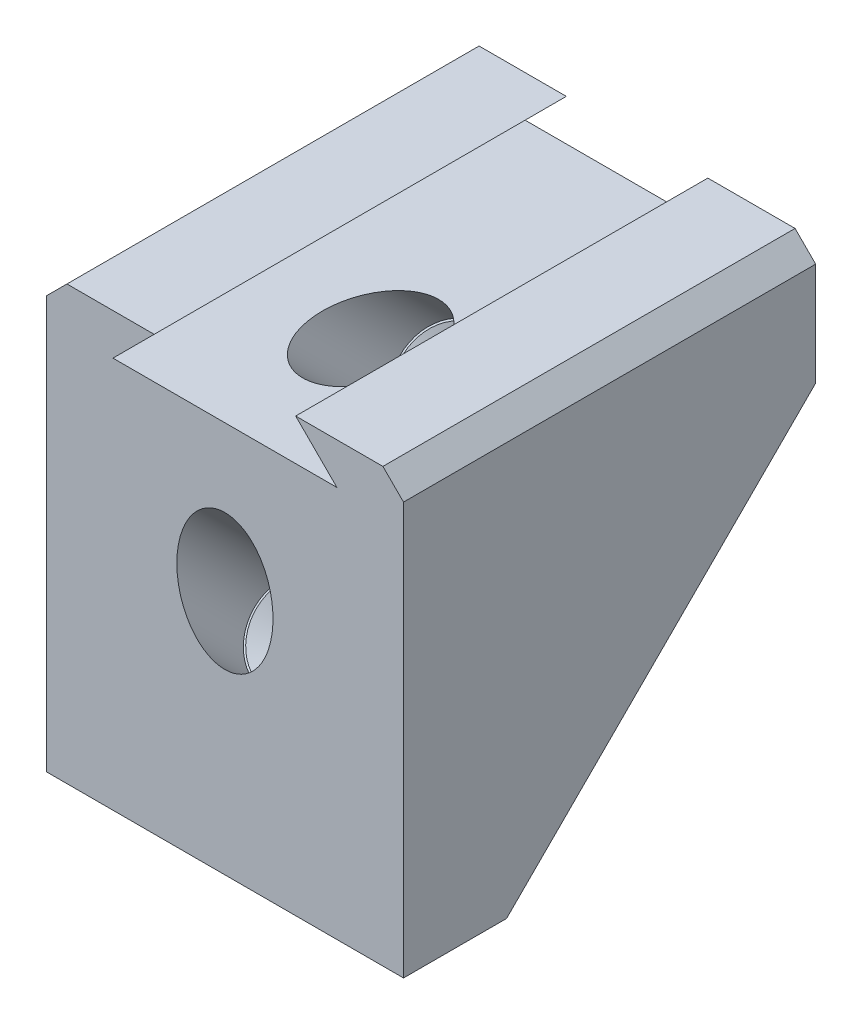
ISO-10303-21;
HEADER;
FILE_DESCRIPTION(('STEP AP214'),'2;1');
FILE_NAME('part.step','',(''),(''),'','','');
FILE_SCHEMA(('AUTOMOTIVE_DESIGN { 1 0 10303 214 1 1 1 1 }'));
ENDSEC;
DATA;
#1=APPLICATION_CONTEXT('core data for automotive mechanical design processes');
#2=APPLICATION_PROTOCOL_DEFINITION('international standard','automotive_design',2000,#1);
#3=PRODUCT_CONTEXT('',#1,'mechanical');
#4=PRODUCT('Part','Part','',(#3));
#5=PRODUCT_RELATED_PRODUCT_CATEGORY('part','',(#4));
#6=PRODUCT_DEFINITION_FORMATION('','',#4);
#7=PRODUCT_DEFINITION_CONTEXT('part definition',#1,'design');
#8=PRODUCT_DEFINITION('design','',#6,#7);
#9=PRODUCT_DEFINITION_SHAPE('','',#8);
#10=(LENGTH_UNIT() NAMED_UNIT(*) SI_UNIT(.MILLI.,.METRE.));
#11=(NAMED_UNIT(*) PLANE_ANGLE_UNIT() SI_UNIT($,.RADIAN.));
#12=(NAMED_UNIT(*) SI_UNIT($,.STERADIAN.) SOLID_ANGLE_UNIT());
#13=UNCERTAINTY_MEASURE_WITH_UNIT(LENGTH_MEASURE(1.E-05),#10,'distance_accuracy_value','');
#14=(GEOMETRIC_REPRESENTATION_CONTEXT(3) GLOBAL_UNCERTAINTY_ASSIGNED_CONTEXT((#13)) GLOBAL_UNIT_ASSIGNED_CONTEXT((#10,
#11,#12)) REPRESENTATION_CONTEXT('',''));
#15=CARTESIAN_POINT('',(0.,0.,0.));
#16=DIRECTION('',(0.,0.,1.));
#17=DIRECTION('',(1.,0.,0.));
#18=AXIS2_PLACEMENT_3D('',#15,#16,#17);
#19=CARTESIAN_POINT('',(13.,0.,30.));
#20=DIRECTION('',(-1.,0.,0.));
#21=DIRECTION('',(0.,-1.,0.));
#22=AXIS2_PLACEMENT_3D('',#19,#20,#21);
#23=PLANE('',#22);
#24=DIRECTION('',(0.,1.,0.));
#25=VECTOR('',#24,1.);
#26=CARTESIAN_POINT('',(13.,0.,0.));
#27=LINE('',#26,#25);
#28=CARTESIAN_POINT('',(13.,0.,0.));
#29=VERTEX_POINT('',#28);
#30=CARTESIAN_POINT('',(13.,7.4999999999999,0.));
#31=VERTEX_POINT('',#30);
#32=EDGE_CURVE('E94',#29,#31,#27,.T.);
#33=ORIENTED_EDGE('',*,*,#32,.T.);
#34=DIRECTION('',(0.,0.,-1.));
#35=VECTOR('',#34,1.);
#36=CARTESIAN_POINT('',(13.,7.4999999999999,30.));
#37=LINE('',#36,#35);
#38=CARTESIAN_POINT('',(13.,7.4999999999999,30.));
#39=VERTEX_POINT('',#38);
#40=EDGE_CURVE('E11',#39,#31,#37,.T.);
#41=ORIENTED_EDGE('',*,*,#40,.F.);
#42=DIRECTION('',(0.,1.,0.));
#43=VECTOR('',#42,1.);
#44=CARTESIAN_POINT('',(13.,0.,30.));
#45=LINE('',#44,#43);
#46=CARTESIAN_POINT('',(13.,-22.5000000000002,30.));
#47=VERTEX_POINT('',#46);
#48=EDGE_CURVE('E168',#47,#39,#45,.T.);
#49=ORIENTED_EDGE('',*,*,#48,.F.);
#50=DIRECTION('',(0.,0.,-1.));
#51=VECTOR('',#50,1.);
#52=CARTESIAN_POINT('',(13.,-22.5000000000002,22.5000000000001));
#53=LINE('',#52,#51);
#54=CARTESIAN_POINT('',(13.,-22.5000000000002,22.5000000000001));
#55=VERTEX_POINT('',#54);
#56=EDGE_CURVE('E209',#47,#55,#53,.T.);
#57=ORIENTED_EDGE('',*,*,#56,.T.);
#58=DIRECTION('',(0.,0.707106781186549,-0.707106781186546));
#59=VECTOR('',#58,1.);
#60=CARTESIAN_POINT('',(13.,-22.5000000000002,22.5000000000001));
#61=LINE('',#60,#59);
#62=EDGE_CURVE('E203',#55,#29,#61,.T.);
#63=ORIENTED_EDGE('',*,*,#62,.T.);
#64=EDGE_LOOP('',(#33,#41,#49,#57,#63));
#65=FACE_BOUND('',#64,.T.);
#66=ADVANCED_FACE('F39',(#65),#23,.F.);
#67=CARTESIAN_POINT('',(13.,7.4999999999999,30.));
#68=DIRECTION('',(-0.707106781186529,-0.707106781186565,0.));
#69=DIRECTION('',(0.707106781186566,-0.70710678118653,0.));
#70=AXIS2_PLACEMENT_3D('',#67,#68,#69);
#71=PLANE('',#70);
#72=DIRECTION('',(-0.707106781186565,0.707106781186529,0.));
#73=VECTOR('',#72,1.);
#74=CARTESIAN_POINT('',(13.,7.4999999999999,0.));
#75=LINE('',#74,#73);
#76=CARTESIAN_POINT('',(11.5,8.99999999999982,0.));
#77=VERTEX_POINT('',#76);
#78=EDGE_CURVE('E150',#31,#77,#75,.T.);
#79=ORIENTED_EDGE('',*,*,#78,.T.);
#80=DIRECTION('',(0.,0.,-1.));
#81=VECTOR('',#80,1.);
#82=CARTESIAN_POINT('',(11.5,8.99999999999982,30.));
#83=LINE('',#82,#81);
#84=CARTESIAN_POINT('',(11.5,8.99999999999982,30.));
#85=VERTEX_POINT('',#84);
#86=EDGE_CURVE('E47',#85,#77,#83,.T.);
#87=ORIENTED_EDGE('',*,*,#86,.F.);
#88=DIRECTION('',(-0.707106781186565,0.707106781186529,0.));
#89=VECTOR('',#88,1.);
#90=CARTESIAN_POINT('',(13.,7.4999999999999,30.));
#91=LINE('',#90,#89);
#92=EDGE_CURVE('E102',#39,#85,#91,.T.);
#93=ORIENTED_EDGE('',*,*,#92,.F.);
#94=ORIENTED_EDGE('',*,*,#40,.T.);
#95=EDGE_LOOP('',(#79,#87,#93,#94));
#96=FACE_BOUND('',#95,.T.);
#97=ADVANCED_FACE('F274',(#96),#71,.F.);
#98=CARTESIAN_POINT('',(11.5,8.99999999999982,30.));
#99=DIRECTION('',(0.,-1.,0.));
#100=DIRECTION('',(1.,0.,0.));
#101=AXIS2_PLACEMENT_3D('',#98,#99,#100);
#102=PLANE('',#101);
#103=DIRECTION('',(-1.,0.,0.));
#104=VECTOR('',#103,1.);
#105=CARTESIAN_POINT('',(11.5,8.99999999999982,0.));
#106=LINE('',#105,#104);
#107=CARTESIAN_POINT('',(5.15000000000002,8.99999999999982,0.));
#108=VERTEX_POINT('',#107);
#109=EDGE_CURVE('E153',#77,#108,#106,.T.);
#110=ORIENTED_EDGE('',*,*,#109,.T.);
#111=DIRECTION('',(0.,0.,-1.));
#112=VECTOR('',#111,1.);
#113=CARTESIAN_POINT('',(5.15000000000002,8.99999999999982,30.));
#114=LINE('',#113,#112);
#115=CARTESIAN_POINT('',(5.15000000000002,8.99999999999982,30.));
#116=VERTEX_POINT('',#115);
#117=EDGE_CURVE('E175',#116,#108,#114,.T.);
#118=ORIENTED_EDGE('',*,*,#117,.F.);
#119=DIRECTION('',(-1.,0.,0.));
#120=VECTOR('',#119,1.);
#121=CARTESIAN_POINT('',(11.5,8.99999999999982,30.));
#122=LINE('',#121,#120);
#123=EDGE_CURVE('E183',#85,#116,#122,.T.);
#124=ORIENTED_EDGE('',*,*,#123,.F.);
#125=ORIENTED_EDGE('',*,*,#86,.T.);
#126=EDGE_LOOP('',(#110,#118,#124,#125));
#127=FACE_BOUND('',#126,.T.);
#128=ADVANCED_FACE('F181',(#127),#102,.F.);
#129=CARTESIAN_POINT('',(5.15000000000002,8.99999999999982,30.));
#130=DIRECTION('',(0.70710678118653,0.707106781186565,0.));
#131=DIRECTION('',(-0.707106781186565,0.70710678118653,0.));
#132=AXIS2_PLACEMENT_3D('',#129,#130,#131);
#133=PLANE('',#132);
#134=DIRECTION('',(0.707106781186565,-0.70710678118653,0.));
#135=VECTOR('',#134,1.);
#136=CARTESIAN_POINT('',(5.15000000000002,8.99999999999982,0.));
#137=LINE('',#136,#135);
#138=CARTESIAN_POINT('',(8.15,6.,0.));
#139=VERTEX_POINT('',#138);
#140=EDGE_CURVE('E155',#108,#139,#137,.T.);
#141=ORIENTED_EDGE('',*,*,#140,.T.);
#142=DIRECTION('',(0.,0.,-1.));
#143=VECTOR('',#142,1.);
#144=CARTESIAN_POINT('',(8.15,6.,30.));
#145=LINE('',#144,#143);
#146=CARTESIAN_POINT('',(8.15,6.,30.));
#147=VERTEX_POINT('',#146);
#148=EDGE_CURVE('E172',#147,#139,#145,.T.);
#149=ORIENTED_EDGE('',*,*,#148,.F.);
#150=DIRECTION('',(0.707106781186565,-0.70710678118653,0.));
#151=VECTOR('',#150,1.);
#152=CARTESIAN_POINT('',(5.15000000000002,8.99999999999982,30.));
#153=LINE('',#152,#151);
#154=EDGE_CURVE('E193',#116,#147,#153,.T.);
#155=ORIENTED_EDGE('',*,*,#154,.F.);
#156=ORIENTED_EDGE('',*,*,#117,.T.);
#157=EDGE_LOOP('',(#141,#149,#155,#156));
#158=FACE_BOUND('',#157,.T.);
#159=ADVANCED_FACE('F189',(#158),#133,.F.);
#160=CARTESIAN_POINT('',(8.15,6.,30.));
#161=DIRECTION('',(0.,-1.,0.));
#162=DIRECTION('',(0.,0.,-1.));
#163=AXIS2_PLACEMENT_3D('',#160,#161,#162);
#164=PLANE('',#163);
#165=CARTESIAN_POINT('',(0.,6.,19.3933982822018));
#166=DIRECTION('',(0.,-1.,0.));
#167=DIRECTION('',(0.,0.,-1.));
#168=AXIS2_PLACEMENT_3D('',#165,#166,#167);
#169=ELLIPSE('',#168,4.94974746830584,3.5);
#170=CARTESIAN_POINT('',(0.,6.,14.4436508138959));
#171=VERTEX_POINT('',#170);
#172=EDGE_CURVE('E217',#171,#171,#169,.T.);
#173=ORIENTED_EDGE('',*,*,#172,.T.);
#174=EDGE_LOOP('',(#173));
#175=FACE_BOUND('',#174,.T.);
#176=DIRECTION('',(-1.,0.,0.));
#177=VECTOR('',#176,1.);
#178=CARTESIAN_POINT('',(8.15,6.,0.));
#179=LINE('',#178,#177);
#180=CARTESIAN_POINT('',(-8.15,6.,0.));
#181=VERTEX_POINT('',#180);
#182=EDGE_CURVE('E157',#139,#181,#179,.T.);
#183=ORIENTED_EDGE('',*,*,#182,.T.);
#184=DIRECTION('',(0.,0.,-1.));
#185=VECTOR('',#184,1.);
#186=CARTESIAN_POINT('',(-8.15,6.,30.));
#187=LINE('',#186,#185);
#188=CARTESIAN_POINT('',(-8.15,6.,30.));
#189=VERTEX_POINT('',#188);
#190=EDGE_CURVE('E138',#189,#181,#187,.T.);
#191=ORIENTED_EDGE('',*,*,#190,.F.);
#192=DIRECTION('',(-1.,0.,0.));
#193=VECTOR('',#192,1.);
#194=CARTESIAN_POINT('',(8.15,6.,30.));
#195=LINE('',#194,#193);
#196=EDGE_CURVE('E126',#147,#189,#195,.T.);
#197=ORIENTED_EDGE('',*,*,#196,.F.);
#198=ORIENTED_EDGE('',*,*,#148,.T.);
#199=EDGE_LOOP('',(#183,#191,#197,#198));
#200=FACE_BOUND('',#199,.T.);
#201=ADVANCED_FACE('F192',(#175,#200),#164,.F.);
#202=CARTESIAN_POINT('',(-8.15,6.,30.));
#203=DIRECTION('',(-0.707106781186523,0.707106781186572,0.));
#204=DIRECTION('',(-0.707106781186572,-0.707106781186523,0.));
#205=AXIS2_PLACEMENT_3D('',#202,#203,#204);
#206=PLANE('',#205);
#207=DIRECTION('',(0.707106781186572,0.707106781186523,0.));
#208=VECTOR('',#207,1.);
#209=CARTESIAN_POINT('',(-8.15,6.,0.));
#210=LINE('',#209,#208);
#211=CARTESIAN_POINT('',(-5.14999999999997,8.99999999999982,0.));
#212=VERTEX_POINT('',#211);
#213=EDGE_CURVE('E135',#181,#212,#210,.T.);
#214=ORIENTED_EDGE('',*,*,#213,.T.);
#215=DIRECTION('',(0.,0.,-1.));
#216=VECTOR('',#215,1.);
#217=CARTESIAN_POINT('',(-5.14999999999997,8.99999999999982,30.));
#218=LINE('',#217,#216);
#219=CARTESIAN_POINT('',(-5.14999999999997,8.99999999999982,30.));
#220=VERTEX_POINT('',#219);
#221=EDGE_CURVE('E132',#220,#212,#218,.T.);
#222=ORIENTED_EDGE('',*,*,#221,.F.);
#223=DIRECTION('',(0.707106781186572,0.707106781186523,0.));
#224=VECTOR('',#223,1.);
#225=CARTESIAN_POINT('',(-8.15,6.,30.));
#226=LINE('',#225,#224);
#227=EDGE_CURVE('E119',#189,#220,#226,.T.);
#228=ORIENTED_EDGE('',*,*,#227,.F.);
#229=ORIENTED_EDGE('',*,*,#190,.T.);
#230=EDGE_LOOP('',(#214,#222,#228,#229));
#231=FACE_BOUND('',#230,.T.);
#232=ADVANCED_FACE('F133',(#231),#206,.F.);
#233=CARTESIAN_POINT('',(-5.14999999999997,8.99999999999982,30.));
#234=DIRECTION('',(0.,-1.,0.));
#235=DIRECTION('',(1.,0.,0.));
#236=AXIS2_PLACEMENT_3D('',#233,#234,#235);
#237=PLANE('',#236);
#238=DIRECTION('',(-1.,0.,0.));
#239=VECTOR('',#238,1.);
#240=CARTESIAN_POINT('',(-5.14999999999997,8.99999999999982,0.));
#241=LINE('',#240,#239);
#242=CARTESIAN_POINT('',(-11.5,8.99999999999982,0.));
#243=VERTEX_POINT('',#242);
#244=EDGE_CURVE('E160',#212,#243,#241,.T.);
#245=ORIENTED_EDGE('',*,*,#244,.T.);
#246=DIRECTION('',(0.,0.,-1.));
#247=VECTOR('',#246,1.);
#248=CARTESIAN_POINT('',(-11.5,8.99999999999982,30.));
#249=LINE('',#248,#247);
#250=CARTESIAN_POINT('',(-11.5,8.99999999999982,30.));
#251=VERTEX_POINT('',#250);
#252=EDGE_CURVE('E139',#251,#243,#249,.T.);
#253=ORIENTED_EDGE('',*,*,#252,.F.);
#254=DIRECTION('',(-1.,0.,0.));
#255=VECTOR('',#254,1.);
#256=CARTESIAN_POINT('',(-5.14999999999997,8.99999999999982,30.));
#257=LINE('',#256,#255);
#258=EDGE_CURVE('E123',#220,#251,#257,.T.);
#259=ORIENTED_EDGE('',*,*,#258,.F.);
#260=ORIENTED_EDGE('',*,*,#221,.T.);
#261=EDGE_LOOP('',(#245,#253,#259,#260));
#262=FACE_BOUND('',#261,.T.);
#263=ADVANCED_FACE('F141',(#262),#237,.F.);
#264=CARTESIAN_POINT('',(-11.5,8.99999999999982,30.));
#265=DIRECTION('',(0.707106781186522,-0.707106781186572,0.));
#266=DIRECTION('',(0.707106781186573,0.707106781186523,0.));
#267=AXIS2_PLACEMENT_3D('',#264,#265,#266);
#268=PLANE('',#267);
#269=DIRECTION('',(-0.707106781186573,-0.707106781186523,0.));
#270=VECTOR('',#269,1.);
#271=CARTESIAN_POINT('',(-11.5,8.99999999999982,0.));
#272=LINE('',#271,#270);
#273=CARTESIAN_POINT('',(-13.,7.49999999999992,0.));
#274=VERTEX_POINT('',#273);
#275=EDGE_CURVE('E87',#243,#274,#272,.T.);
#276=ORIENTED_EDGE('',*,*,#275,.T.);
#277=DIRECTION('',(0.,0.,-1.));
#278=VECTOR('',#277,1.);
#279=CARTESIAN_POINT('',(-13.,7.49999999999992,30.));
#280=LINE('',#279,#278);
#281=CARTESIAN_POINT('',(-13.,7.49999999999992,30.));
#282=VERTEX_POINT('',#281);
#283=EDGE_CURVE('E148',#282,#274,#280,.T.);
#284=ORIENTED_EDGE('',*,*,#283,.F.);
#285=DIRECTION('',(-0.707106781186573,-0.707106781186523,0.));
#286=VECTOR('',#285,1.);
#287=CARTESIAN_POINT('',(-11.5,8.99999999999982,30.));
#288=LINE('',#287,#286);
#289=EDGE_CURVE('E55',#251,#282,#288,.T.);
#290=ORIENTED_EDGE('',*,*,#289,.F.);
#291=ORIENTED_EDGE('',*,*,#252,.T.);
#292=EDGE_LOOP('',(#276,#284,#290,#291));
#293=FACE_BOUND('',#292,.T.);
#294=ADVANCED_FACE('F301',(#293),#268,.F.);
#295=CARTESIAN_POINT('',(-13.,7.49999999999992,30.));
#296=DIRECTION('',(1.,0.,0.));
#297=DIRECTION('',(0.,1.,0.));
#298=AXIS2_PLACEMENT_3D('',#295,#296,#297);
#299=PLANE('',#298);
#300=DIRECTION('',(0.,-1.,0.));
#301=VECTOR('',#300,1.);
#302=CARTESIAN_POINT('',(-13.,7.49999999999992,0.));
#303=LINE('',#302,#301);
#304=CARTESIAN_POINT('',(-13.,0.,0.));
#305=VERTEX_POINT('',#304);
#306=EDGE_CURVE('E163',#274,#305,#303,.T.);
#307=ORIENTED_EDGE('',*,*,#306,.T.);
#308=DIRECTION('',(0.,-0.707106781186549,0.707106781186546));
#309=VECTOR('',#308,1.);
#310=CARTESIAN_POINT('',(-13.,-22.5000000000002,22.5000000000001));
#311=LINE('',#310,#309);
#312=CARTESIAN_POINT('',(-13.,-22.5000000000002,22.5000000000001));
#313=VERTEX_POINT('',#312);
#314=EDGE_CURVE('E151',#305,#313,#311,.T.);
#315=ORIENTED_EDGE('',*,*,#314,.T.);
#316=DIRECTION('',(0.,0.,1.));
#317=VECTOR('',#316,1.);
#318=CARTESIAN_POINT('',(-13.,-22.5000000000002,22.5000000000001));
#319=LINE('',#318,#317);
#320=CARTESIAN_POINT('',(-13.,-22.5000000000002,30.));
#321=VERTEX_POINT('',#320);
#322=EDGE_CURVE('E206',#313,#321,#319,.T.);
#323=ORIENTED_EDGE('',*,*,#322,.T.);
#324=DIRECTION('',(0.,-1.,0.));
#325=VECTOR('',#324,1.);
#326=CARTESIAN_POINT('',(-13.,7.49999999999992,30.));
#327=LINE('',#326,#325);
#328=EDGE_CURVE('E143',#282,#321,#327,.T.);
#329=ORIENTED_EDGE('',*,*,#328,.F.);
#330=ORIENTED_EDGE('',*,*,#283,.T.);
#331=EDGE_LOOP('',(#307,#315,#323,#329,#330));
#332=FACE_BOUND('',#331,.T.);
#333=ADVANCED_FACE('F299',(#332),#299,.F.);
#334=CARTESIAN_POINT('',(0.,0.,30.));
#335=DIRECTION('',(0.,0.,1.));
#336=DIRECTION('',(1.,0.,0.));
#337=AXIS2_PLACEMENT_3D('',#334,#335,#336);
#338=PLANE('',#337);
#339=CARTESIAN_POINT('',(0.,-4.60660171779821,30.));
#340=DIRECTION('',(0.,0.,1.));
#341=DIRECTION('',(0.,-1.,0.));
#342=AXIS2_PLACEMENT_3D('',#339,#340,#341);
#343=ELLIPSE('',#342,4.94974746830582,3.5);
#344=CARTESIAN_POINT('',(0.,-9.55634918610403,30.));
#345=VERTEX_POINT('',#344);
#346=EDGE_CURVE('E225',#345,#345,#343,.T.);
#347=ORIENTED_EDGE('',*,*,#346,.F.);
#348=EDGE_LOOP('',(#347));
#349=FACE_BOUND('',#348,.T.);
#350=ORIENTED_EDGE('',*,*,#48,.T.);
#351=ORIENTED_EDGE('',*,*,#92,.T.);
#352=ORIENTED_EDGE('',*,*,#123,.T.);
#353=ORIENTED_EDGE('',*,*,#154,.T.);
#354=ORIENTED_EDGE('',*,*,#196,.T.);
#355=ORIENTED_EDGE('',*,*,#227,.T.);
#356=ORIENTED_EDGE('',*,*,#258,.T.);
#357=ORIENTED_EDGE('',*,*,#289,.T.);
#358=ORIENTED_EDGE('',*,*,#328,.T.);
#359=DIRECTION('',(1.,0.,0.));
#360=VECTOR('',#359,1.);
#361=CARTESIAN_POINT('',(-50.5000000000001,-22.5000000000002,30.));
#362=LINE('',#361,#360);
#363=EDGE_CURVE('E199',#321,#47,#362,.T.);
#364=ORIENTED_EDGE('',*,*,#363,.T.);
#365=EDGE_LOOP('',(#350,#351,#352,#353,#354,#355,#356,#357,#358,#364));
#366=FACE_BOUND('',#365,.T.);
#367=ADVANCED_FACE('F121',(#349,#366),#338,.T.);
#368=CARTESIAN_POINT('',(0.,0.,0.));
#369=DIRECTION('',(0.,0.,1.));
#370=DIRECTION('',(1.,0.,0.));
#371=AXIS2_PLACEMENT_3D('',#368,#369,#370);
#372=PLANE('',#371);
#373=ORIENTED_EDGE('',*,*,#32,.F.);
#374=DIRECTION('',(1.,0.,0.));
#375=VECTOR('',#374,1.);
#376=CARTESIAN_POINT('',(-13.,0.,0.));
#377=LINE('',#376,#375);
#378=EDGE_CURVE('E166',#305,#29,#377,.T.);
#379=ORIENTED_EDGE('',*,*,#378,.F.);
#380=ORIENTED_EDGE('',*,*,#306,.F.);
#381=ORIENTED_EDGE('',*,*,#275,.F.);
#382=ORIENTED_EDGE('',*,*,#244,.F.);
#383=ORIENTED_EDGE('',*,*,#213,.F.);
#384=ORIENTED_EDGE('',*,*,#182,.F.);
#385=ORIENTED_EDGE('',*,*,#140,.F.);
#386=ORIENTED_EDGE('',*,*,#109,.F.);
#387=ORIENTED_EDGE('',*,*,#78,.F.);
#388=EDGE_LOOP('',(#373,#379,#380,#381,#382,#383,#384,#385,#386,#387));
#389=FACE_BOUND('',#388,.T.);
#390=ADVANCED_FACE('F185',(#389),#372,.F.);
#391=CARTESIAN_POINT('',(-50.5000000000001,-22.5000000000002,22.5000000000001));
#392=DIRECTION('',(0.,-0.707106781186546,-0.707106781186549));
#393=DIRECTION('',(0.,0.707106781186549,-0.707106781186546));
#394=AXIS2_PLACEMENT_3D('',#391,#392,#393);
#395=PLANE('',#394);
#396=CARTESIAN_POINT('',(0.,-6.69669914110088,6.69669914110085));
#397=DIRECTION('',(0.,-0.707106781186546,-0.707106781186549));
#398=DIRECTION('',(0.,0.707106781186549,-0.707106781186546));
#399=AXIS2_PLACEMENT_3D('',#396,#397,#398);
#400=CIRCLE('',#399,1.69999999999999);
#401=CARTESIAN_POINT('',(0.,-5.49461761308375,5.49461761308373));
#402=VERTEX_POINT('',#401);
#403=EDGE_CURVE('E237',#402,#402,#400,.T.);
#404=ORIENTED_EDGE('',*,*,#403,.F.);
#405=EDGE_LOOP('',(#404));
#406=FACE_BOUND('',#405,.T.);
#407=CARTESIAN_POINT('',(0.,-17.3033008588991,17.303300858899));
#408=DIRECTION('',(0.,-0.707106781186546,-0.707106781186549));
#409=DIRECTION('',(0.,0.707106781186549,-0.707106781186546));
#410=AXIS2_PLACEMENT_3D('',#407,#408,#409);
#411=CIRCLE('',#410,1.69999999999999);
#412=CARTESIAN_POINT('',(0.,-16.101219330882,16.1012193308819));
#413=VERTEX_POINT('',#412);
#414=EDGE_CURVE('E228',#413,#413,#411,.T.);
#415=ORIENTED_EDGE('',*,*,#414,.F.);
#416=EDGE_LOOP('',(#415));
#417=FACE_BOUND('',#416,.T.);
#418=ORIENTED_EDGE('',*,*,#314,.F.);
#419=ORIENTED_EDGE('',*,*,#378,.T.);
#420=ORIENTED_EDGE('',*,*,#62,.F.);
#421=DIRECTION('',(1.,0.,0.));
#422=VECTOR('',#421,1.);
#423=CARTESIAN_POINT('',(-50.5000000000001,-22.5000000000002,22.5000000000001));
#424=LINE('',#423,#422);
#425=EDGE_CURVE('E202',#313,#55,#424,.T.);
#426=ORIENTED_EDGE('',*,*,#425,.F.);
#427=EDGE_LOOP('',(#418,#419,#420,#426));
#428=FACE_BOUND('',#427,.T.);
#429=ADVANCED_FACE('F289',(#406,#417,#428),#395,.T.);
#430=CARTESIAN_POINT('',(-50.5000000000001,-22.5000000000002,22.5000000000001));
#431=DIRECTION('',(0.,-1.,0.));
#432=DIRECTION('',(1.,0.,0.));
#433=AXIS2_PLACEMENT_3D('',#430,#431,#432);
#434=PLANE('',#433);
#435=ORIENTED_EDGE('',*,*,#322,.F.);
#436=ORIENTED_EDGE('',*,*,#425,.T.);
#437=ORIENTED_EDGE('',*,*,#56,.F.);
#438=ORIENTED_EDGE('',*,*,#363,.F.);
#439=EDGE_LOOP('',(#435,#436,#437,#438));
#440=FACE_BOUND('',#439,.T.);
#441=ADVANCED_FACE('F313',(#440),#434,.T.);
#442=CARTESIAN_POINT('',(0.,2.19769914110078,36.804300858899));
#443=DIRECTION('',(0.,-0.707106781186546,-0.707106781186549));
#444=DIRECTION('',(0.,0.707106781186549,-0.707106781186546));
#445=AXIS2_PLACEMENT_3D('',#442,#443,#444);
#446=CYLINDRICAL_SURFACE('',#445,3.5);
#447=ORIENTED_EDGE('',*,*,#346,.T.);
#448=EDGE_LOOP('',(#447));
#449=FACE_BOUND('',#448,.T.);
#450=CARTESIAN_POINT('',(0.,-10.2322330470336,24.3743686707645));
#451=DIRECTION('',(0.,0.707106781186546,0.707106781186549));
#452=DIRECTION('',(0.,-0.707106781186549,0.707106781186546));
#453=AXIS2_PLACEMENT_3D('',#450,#451,#452);
#454=CIRCLE('',#453,3.5);
#455=CARTESIAN_POINT('',(0.,-12.7071067811866,26.8492424049174));
#456=VERTEX_POINT('',#455);
#457=EDGE_CURVE('E220',#456,#456,#454,.T.);
#458=ORIENTED_EDGE('',*,*,#457,.F.);
#459=EDGE_LOOP('',(#458));
#460=FACE_BOUND('',#459,.T.);
#461=ADVANCED_FACE('F315',(#449,#460),#446,.F.);
#462=CARTESIAN_POINT('',(0.,-10.2322330470336,24.3743686707645));
#463=DIRECTION('',(0.,0.707106781186546,0.707106781186549));
#464=DIRECTION('',(0.,-0.707106781186549,0.707106781186546));
#465=AXIS2_PLACEMENT_3D('',#462,#463,#464);
#466=PLANE('',#465);
#467=CARTESIAN_POINT('',(0.,-10.2322330470336,24.3743686707645));
#468=DIRECTION('',(0.,0.707106781186546,0.707106781186549));
#469=DIRECTION('',(0.,-0.707106781186549,0.707106781186546));
#470=AXIS2_PLACEMENT_3D('',#467,#468,#469);
#471=CIRCLE('',#470,3.36);
#472=CARTESIAN_POINT('',(0.,-12.6081118318205,26.7502474555513));
#473=VERTEX_POINT('',#472);
#474=EDGE_CURVE('E234',#473,#473,#471,.T.);
#475=ORIENTED_EDGE('',*,*,#474,.F.);
#476=EDGE_LOOP('',(#475));
#477=FACE_BOUND('',#476,.T.);
#478=ORIENTED_EDGE('',*,*,#457,.T.);
#479=EDGE_LOOP('',(#478));
#480=FACE_BOUND('',#479,.T.);
#481=ADVANCED_FACE('F259',(#477,#480),#466,.T.);
#482=CARTESIAN_POINT('',(0.,12.804300858899,26.1976991411008));
#483=DIRECTION('',(0.,-0.707106781186546,-0.707106781186549));
#484=DIRECTION('',(0.,0.707106781186549,-0.707106781186546));
#485=AXIS2_PLACEMENT_3D('',#482,#483,#484);
#486=CYLINDRICAL_SURFACE('',#485,3.5);
#487=CARTESIAN_POINT('',(0.,0.374368670764588,13.7677669529663));
#488=DIRECTION('',(0.,0.707106781186546,0.707106781186549));
#489=DIRECTION('',(0.,-0.707106781186549,0.707106781186546));
#490=AXIS2_PLACEMENT_3D('',#487,#488,#489);
#491=CIRCLE('',#490,3.5);
#492=CARTESIAN_POINT('',(0.,-2.10050506338833,16.2426406871193));
#493=VERTEX_POINT('',#492);
#494=EDGE_CURVE('E212',#493,#493,#491,.T.);
#495=ORIENTED_EDGE('',*,*,#494,.F.);
#496=EDGE_LOOP('',(#495));
#497=FACE_BOUND('',#496,.T.);
#498=ORIENTED_EDGE('',*,*,#172,.F.);
#499=EDGE_LOOP('',(#498));
#500=FACE_BOUND('',#499,.T.);
#501=ADVANCED_FACE('F253',(#497,#500),#486,.F.);
#502=CARTESIAN_POINT('',(0.,0.374368670764588,13.7677669529663));
#503=DIRECTION('',(0.,0.707106781186546,0.707106781186549));
#504=DIRECTION('',(0.,-0.707106781186549,0.707106781186546));
#505=AXIS2_PLACEMENT_3D('',#502,#503,#504);
#506=PLANE('',#505);
#507=CARTESIAN_POINT('',(0.,0.374368670764589,13.7677669529663));
#508=DIRECTION('',(0.,0.707106781186546,0.707106781186549));
#509=DIRECTION('',(0.,-0.707106781186549,0.707106781186546));
#510=AXIS2_PLACEMENT_3D('',#507,#508,#509);
#511=CIRCLE('',#510,3.36);
#512=CARTESIAN_POINT('',(0.,-2.00151011402221,16.1436457377531));
#513=VERTEX_POINT('',#512);
#514=EDGE_CURVE('E243',#513,#513,#511,.T.);
#515=ORIENTED_EDGE('',*,*,#514,.F.);
#516=EDGE_LOOP('',(#515));
#517=FACE_BOUND('',#516,.T.);
#518=ORIENTED_EDGE('',*,*,#494,.T.);
#519=EDGE_LOOP('',(#518));
#520=FACE_BOUND('',#519,.T.);
#521=ADVANCED_FACE('F249',(#517,#520),#506,.T.);
#522=CARTESIAN_POINT('',(0.,-10.2322330470336,24.3743686707645));
#523=DIRECTION('',(0.,0.707106781186546,0.707106781186549));
#524=DIRECTION('',(0.,-0.707106781186549,0.707106781186546));
#525=AXIS2_PLACEMENT_3D('',#522,#523,#524);
#526=CYLINDRICAL_SURFACE('',#525,1.69999999999999);
#527=CARTESIAN_POINT('',(0.,-11.4060303038033,23.2005714139949));
#528=DIRECTION('',(0.,0.707106781186546,0.707106781186549));
#529=DIRECTION('',(0.,-0.707106781186549,0.707106781186546));
#530=AXIS2_PLACEMENT_3D('',#527,#528,#529);
#531=CIRCLE('',#530,1.69999999999999);
#532=CARTESIAN_POINT('',(0.,-12.6081118318205,24.402652942012));
#533=VERTEX_POINT('',#532);
#534=EDGE_CURVE('E231',#533,#533,#531,.T.);
#535=ORIENTED_EDGE('',*,*,#534,.T.);
#536=EDGE_LOOP('',(#535));
#537=FACE_BOUND('',#536,.T.);
#538=ORIENTED_EDGE('',*,*,#414,.T.);
#539=EDGE_LOOP('',(#538));
#540=FACE_BOUND('',#539,.T.);
#541=ADVANCED_FACE('F252',(#537,#540),#526,.F.);
#542=CARTESIAN_POINT('',(0.,-10.2322330470336,24.3743686707645));
#543=DIRECTION('',(0.,0.707106781186546,0.707106781186549));
#544=DIRECTION('',(0.,-0.707106781186549,0.707106781186546));
#545=AXIS2_PLACEMENT_3D('',#542,#543,#544);
#546=CONICAL_SURFACE('',#545,3.36,0.785398163397445);
#547=ORIENTED_EDGE('',*,*,#534,.F.);
#548=EDGE_LOOP('',(#547));
#549=FACE_BOUND('',#548,.T.);
#550=ORIENTED_EDGE('',*,*,#474,.T.);
#551=EDGE_LOOP('',(#550));
#552=FACE_BOUND('',#551,.T.);
#553=ADVANCED_FACE('F327',(#549,#552),#546,.F.);
#554=CARTESIAN_POINT('',(0.,0.374368670764588,13.7677669529663));
#555=DIRECTION('',(0.,0.707106781186546,0.707106781186549));
#556=DIRECTION('',(0.,-0.707106781186549,0.707106781186546));
#557=AXIS2_PLACEMENT_3D('',#554,#555,#556);
#558=CYLINDRICAL_SURFACE('',#557,1.69999999999999);
#559=CARTESIAN_POINT('',(0.,-0.799428586005095,12.5939696961967));
#560=DIRECTION('',(0.,0.707106781186546,0.707106781186549));
#561=DIRECTION('',(0.,-0.707106781186549,0.707106781186546));
#562=AXIS2_PLACEMENT_3D('',#559,#560,#561);
#563=CIRCLE('',#562,1.69999999999999);
#564=CARTESIAN_POINT('',(0.,-2.00151011402222,13.7960512242138));
#565=VERTEX_POINT('',#564);
#566=EDGE_CURVE('E240',#565,#565,#563,.T.);
#567=ORIENTED_EDGE('',*,*,#566,.T.);
#568=EDGE_LOOP('',(#567));
#569=FACE_BOUND('',#568,.T.);
#570=ORIENTED_EDGE('',*,*,#403,.T.);
#571=EDGE_LOOP('',(#570));
#572=FACE_BOUND('',#571,.T.);
#573=ADVANCED_FACE('F331',(#569,#572),#558,.F.);
#574=CARTESIAN_POINT('',(0.,0.374368670764589,13.7677669529663));
#575=DIRECTION('',(0.,0.707106781186546,0.707106781186549));
#576=DIRECTION('',(0.,-0.707106781186549,0.707106781186546));
#577=AXIS2_PLACEMENT_3D('',#574,#575,#576);
#578=CONICAL_SURFACE('',#577,3.36,0.785398163397444);
#579=ORIENTED_EDGE('',*,*,#566,.F.);
#580=EDGE_LOOP('',(#579));
#581=FACE_BOUND('',#580,.T.);
#582=ORIENTED_EDGE('',*,*,#514,.T.);
#583=EDGE_LOOP('',(#582));
#584=FACE_BOUND('',#583,.T.);
#585=ADVANCED_FACE('F247',(#581,#584),#578,.F.);
#586=CLOSED_SHELL('',(#66,#97,#128,#159,#201,#232,#263,#294,#333,#367,#390,#429,#441,#461,#481,
#501,#521,#541,#553,#573,#585));
#587=MANIFOLD_SOLID_BREP('B2',#586);
#588=ADVANCED_BREP_SHAPE_REPRESENTATION('',(#18,#587),#14);
#589=SHAPE_DEFINITION_REPRESENTATION(#9,#588);
ENDSEC;
END-ISO-10303-21;
